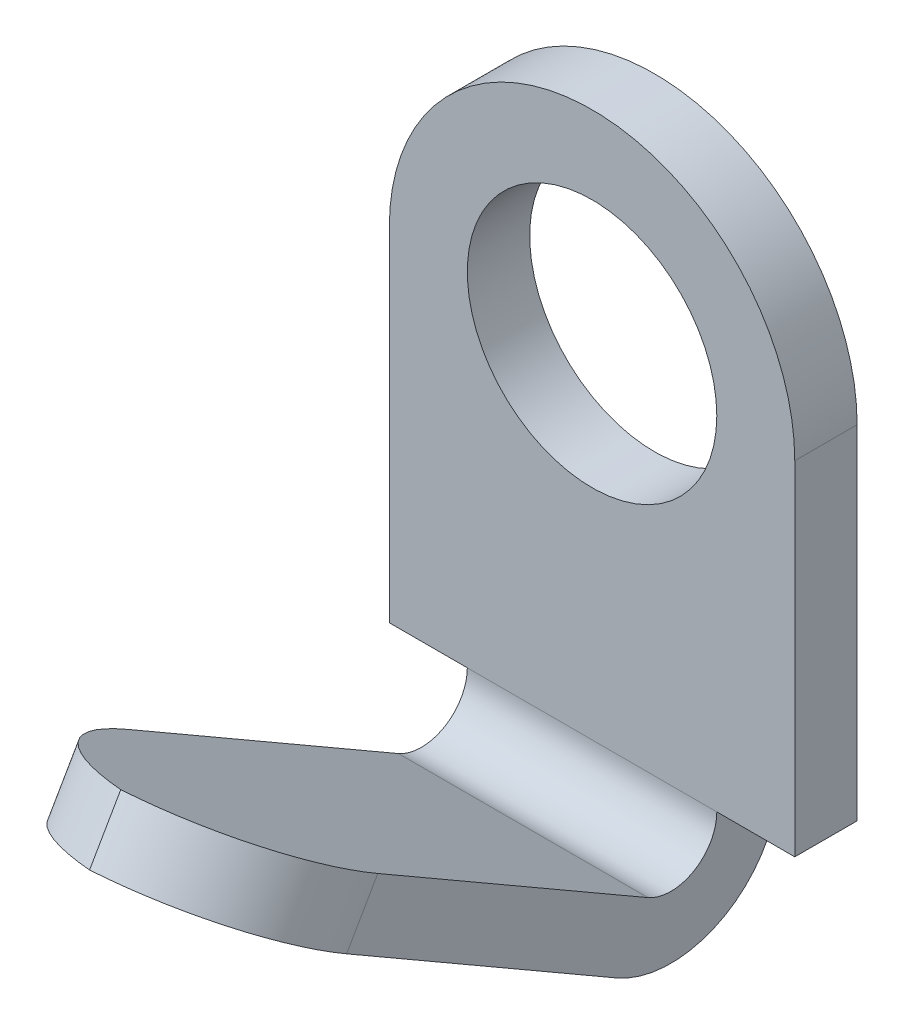
ISO-10303-21;
HEADER;
FILE_DESCRIPTION(('STEP AP214'),'2;1');
FILE_NAME('part.step','',(''),(''),'','','');
FILE_SCHEMA(('AUTOMOTIVE_DESIGN { 1 0 10303 214 1 1 1 1 }'));
ENDSEC;
DATA;
#1=APPLICATION_CONTEXT('core data for automotive mechanical design processes');
#2=APPLICATION_PROTOCOL_DEFINITION('international standard','automotive_design',2000,#1);
#3=PRODUCT_CONTEXT('',#1,'mechanical');
#4=PRODUCT('Part','Part','',(#3));
#5=PRODUCT_RELATED_PRODUCT_CATEGORY('part','',(#4));
#6=PRODUCT_DEFINITION_FORMATION('','',#4);
#7=PRODUCT_DEFINITION_CONTEXT('part definition',#1,'design');
#8=PRODUCT_DEFINITION('design','',#6,#7);
#9=PRODUCT_DEFINITION_SHAPE('','',#8);
#10=(LENGTH_UNIT() NAMED_UNIT(*) SI_UNIT(.MILLI.,.METRE.));
#11=(NAMED_UNIT(*) PLANE_ANGLE_UNIT() SI_UNIT($,.RADIAN.));
#12=(NAMED_UNIT(*) SI_UNIT($,.STERADIAN.) SOLID_ANGLE_UNIT());
#13=UNCERTAINTY_MEASURE_WITH_UNIT(LENGTH_MEASURE(1.E-05),#10,'distance_accuracy_value','');
#14=(GEOMETRIC_REPRESENTATION_CONTEXT(3) GLOBAL_UNCERTAINTY_ASSIGNED_CONTEXT((#13)) GLOBAL_UNIT_ASSIGNED_CONTEXT((#10,
#11,#12)) REPRESENTATION_CONTEXT('',''));
#15=CARTESIAN_POINT('',(0.,0.,0.));
#16=DIRECTION('',(0.,0.,1.));
#17=DIRECTION('',(1.,0.,0.));
#18=AXIS2_PLACEMENT_3D('',#15,#16,#17);
#19=CARTESIAN_POINT('',(-0.65,-1.1,0.2));
#20=DIRECTION('',(0.,1.,0.));
#21=DIRECTION('',(0.,0.,1.));
#22=AXIS2_PLACEMENT_3D('',#19,#20,#21);
#23=PLANE('',#22);
#24=DIRECTION('',(0.,0.,-1.));
#25=VECTOR('',#24,1.);
#26=CARTESIAN_POINT('',(-0.4,-1.1,0.));
#27=LINE('',#26,#25);
#28=CARTESIAN_POINT('',(-0.4,-1.1,0.2));
#29=VERTEX_POINT('',#28);
#30=CARTESIAN_POINT('',(-0.4,-1.1,0.));
#31=VERTEX_POINT('',#30);
#32=EDGE_CURVE('E132',#29,#31,#27,.T.);
#33=ORIENTED_EDGE('',*,*,#32,.F.);
#34=DIRECTION('',(1.,0.,0.));
#35=VECTOR('',#34,1.);
#36=CARTESIAN_POINT('',(-0.65,-1.1,0.2));
#37=LINE('',#36,#35);
#38=CARTESIAN_POINT('',(-0.65,-1.1,0.2));
#39=VERTEX_POINT('',#38);
#40=EDGE_CURVE('E140',#39,#29,#37,.T.);
#41=ORIENTED_EDGE('',*,*,#40,.F.);
#42=DIRECTION('',(0.,0.,-1.));
#43=VECTOR('',#42,1.);
#44=CARTESIAN_POINT('',(-0.65,-1.1,0.2));
#45=LINE('',#44,#43);
#46=CARTESIAN_POINT('',(-0.65,-1.1,0.));
#47=VERTEX_POINT('',#46);
#48=EDGE_CURVE('E174',#39,#47,#45,.T.);
#49=ORIENTED_EDGE('',*,*,#48,.T.);
#50=DIRECTION('',(1.,0.,0.));
#51=VECTOR('',#50,1.);
#52=CARTESIAN_POINT('',(-0.65,-1.1,0.));
#53=LINE('',#52,#51);
#54=EDGE_CURVE('E142',#47,#31,#53,.T.);
#55=ORIENTED_EDGE('',*,*,#54,.T.);
#56=EDGE_LOOP('',(#33,#41,#49,#55));
#57=FACE_BOUND('',#56,.T.);
#58=ADVANCED_FACE('F32',(#57),#23,.F.);
#59=CARTESIAN_POINT('',(0.,0.,0.2));
#60=DIRECTION('',(0.,0.,-1.));
#61=DIRECTION('',(-1.,0.,0.));
#62=AXIS2_PLACEMENT_3D('',#59,#60,#61);
#63=PLANE('',#62);
#64=CARTESIAN_POINT('',(0.,0.,0.2));
#65=DIRECTION('',(0.,0.,1.));
#66=DIRECTION('',(-1.,0.,0.));
#67=AXIS2_PLACEMENT_3D('',#64,#65,#66);
#68=CIRCLE('',#67,0.65);
#69=CARTESIAN_POINT('',(0.65,0.,0.2));
#70=VERTEX_POINT('',#69);
#71=CARTESIAN_POINT('',(-0.65,0.,0.2));
#72=VERTEX_POINT('',#71);
#73=EDGE_CURVE('E168',#70,#72,#68,.T.);
#74=ORIENTED_EDGE('',*,*,#73,.T.);
#75=DIRECTION('',(0.,-1.,0.));
#76=VECTOR('',#75,1.);
#77=CARTESIAN_POINT('',(-0.65,0.,0.2));
#78=LINE('',#77,#76);
#79=EDGE_CURVE('E148',#72,#39,#78,.T.);
#80=ORIENTED_EDGE('',*,*,#79,.T.);
#81=ORIENTED_EDGE('',*,*,#40,.T.);
#82=DIRECTION('',(1.,0.,0.));
#83=VECTOR('',#82,1.);
#84=CARTESIAN_POINT('',(-0.4,-1.1,0.2));
#85=LINE('',#84,#83);
#86=CARTESIAN_POINT('',(0.4,-1.1,0.2));
#87=VERTEX_POINT('',#86);
#88=EDGE_CURVE('E117',#29,#87,#85,.T.);
#89=ORIENTED_EDGE('',*,*,#88,.T.);
#90=CARTESIAN_POINT('',(0.65,-1.1,0.2));
#91=VERTEX_POINT('',#90);
#92=EDGE_CURVE('E151',#87,#91,#37,.T.);
#93=ORIENTED_EDGE('',*,*,#92,.T.);
#94=DIRECTION('',(0.,1.,0.));
#95=VECTOR('',#94,1.);
#96=CARTESIAN_POINT('',(0.65,-1.1,0.2));
#97=LINE('',#96,#95);
#98=EDGE_CURVE('E150',#91,#70,#97,.T.);
#99=ORIENTED_EDGE('',*,*,#98,.T.);
#100=EDGE_LOOP('',(#74,#80,#81,#89,#93,#99));
#101=FACE_BOUND('',#100,.T.);
#102=CARTESIAN_POINT('',(0.,0.,0.2));
#103=DIRECTION('',(0.,0.,1.));
#104=DIRECTION('',(1.,0.,0.));
#105=AXIS2_PLACEMENT_3D('',#102,#103,#104);
#106=CIRCLE('',#105,0.4);
#107=CARTESIAN_POINT('',(0.4,0.,0.2));
#108=VERTEX_POINT('',#107);
#109=EDGE_CURVE('E162',#108,#108,#106,.T.);
#110=ORIENTED_EDGE('',*,*,#109,.F.);
#111=EDGE_LOOP('',(#110));
#112=FACE_BOUND('',#111,.T.);
#113=ADVANCED_FACE('F146',(#101,#112),#63,.F.);
#114=CARTESIAN_POINT('',(0.,0.,0.));
#115=DIRECTION('',(0.,0.,-1.));
#116=DIRECTION('',(-1.,0.,0.));
#117=AXIS2_PLACEMENT_3D('',#114,#115,#116);
#118=PLANE('',#117);
#119=CARTESIAN_POINT('',(0.,0.,0.));
#120=DIRECTION('',(0.,0.,1.));
#121=DIRECTION('',(-1.,0.,0.));
#122=AXIS2_PLACEMENT_3D('',#119,#120,#121);
#123=CIRCLE('',#122,0.65);
#124=CARTESIAN_POINT('',(0.65,0.,0.));
#125=VERTEX_POINT('',#124);
#126=CARTESIAN_POINT('',(-0.65,0.,0.));
#127=VERTEX_POINT('',#126);
#128=EDGE_CURVE('E158',#125,#127,#123,.T.);
#129=ORIENTED_EDGE('',*,*,#128,.F.);
#130=DIRECTION('',(0.,1.,0.));
#131=VECTOR('',#130,1.);
#132=CARTESIAN_POINT('',(0.65,-1.1,0.));
#133=LINE('',#132,#131);
#134=CARTESIAN_POINT('',(0.65,-1.1,0.));
#135=VERTEX_POINT('',#134);
#136=EDGE_CURVE('E166',#135,#125,#133,.T.);
#137=ORIENTED_EDGE('',*,*,#136,.F.);
#138=CARTESIAN_POINT('',(0.4,-1.1,0.));
#139=VERTEX_POINT('',#138);
#140=EDGE_CURVE('E164',#139,#135,#53,.T.);
#141=ORIENTED_EDGE('',*,*,#140,.F.);
#142=DIRECTION('',(1.,0.,0.));
#143=VECTOR('',#142,1.);
#144=CARTESIAN_POINT('',(-0.4,-1.1,0.));
#145=LINE('',#144,#143);
#146=EDGE_CURVE('E219',#31,#139,#145,.T.);
#147=ORIENTED_EDGE('',*,*,#146,.F.);
#148=ORIENTED_EDGE('',*,*,#54,.F.);
#149=DIRECTION('',(0.,-1.,0.));
#150=VECTOR('',#149,1.);
#151=CARTESIAN_POINT('',(-0.65,0.,0.));
#152=LINE('',#151,#150);
#153=EDGE_CURVE('E161',#127,#47,#152,.T.);
#154=ORIENTED_EDGE('',*,*,#153,.F.);
#155=EDGE_LOOP('',(#129,#137,#141,#147,#148,#154));
#156=FACE_BOUND('',#155,.T.);
#157=CARTESIAN_POINT('',(0.,0.,0.));
#158=DIRECTION('',(0.,0.,1.));
#159=DIRECTION('',(1.,0.,0.));
#160=AXIS2_PLACEMENT_3D('',#157,#158,#159);
#161=CIRCLE('',#160,0.4);
#162=CARTESIAN_POINT('',(0.4,0.,0.));
#163=VERTEX_POINT('',#162);
#164=EDGE_CURVE('E221',#163,#163,#161,.T.);
#165=ORIENTED_EDGE('',*,*,#164,.T.);
#166=EDGE_LOOP('',(#165));
#167=FACE_BOUND('',#166,.T.);
#168=ADVANCED_FACE('F238',(#156,#167),#118,.T.);
#169=CARTESIAN_POINT('',(0.,0.,0.2));
#170=DIRECTION('',(0.,0.,-1.));
#171=DIRECTION('',(-1.,0.,0.));
#172=AXIS2_PLACEMENT_3D('',#169,#170,#171);
#173=CYLINDRICAL_SURFACE('',#172,0.65);
#174=ORIENTED_EDGE('',*,*,#128,.T.);
#175=DIRECTION('',(0.,0.,-1.));
#176=VECTOR('',#175,1.);
#177=CARTESIAN_POINT('',(-0.65,0.,0.2));
#178=LINE('',#177,#176);
#179=EDGE_CURVE('E176',#72,#127,#178,.T.);
#180=ORIENTED_EDGE('',*,*,#179,.F.);
#181=ORIENTED_EDGE('',*,*,#73,.F.);
#182=DIRECTION('',(0.,0.,-1.));
#183=VECTOR('',#182,1.);
#184=CARTESIAN_POINT('',(0.65,0.,0.2));
#185=LINE('',#184,#183);
#186=EDGE_CURVE('E153',#70,#125,#185,.T.);
#187=ORIENTED_EDGE('',*,*,#186,.T.);
#188=EDGE_LOOP('',(#174,#180,#181,#187));
#189=FACE_BOUND('',#188,.T.);
#190=ADVANCED_FACE('F233',(#189),#173,.T.);
#191=CARTESIAN_POINT('',(-0.65,0.,0.2));
#192=DIRECTION('',(1.,0.,0.));
#193=DIRECTION('',(0.,1.,0.));
#194=AXIS2_PLACEMENT_3D('',#191,#192,#193);
#195=PLANE('',#194);
#196=ORIENTED_EDGE('',*,*,#153,.T.);
#197=ORIENTED_EDGE('',*,*,#48,.F.);
#198=ORIENTED_EDGE('',*,*,#79,.F.);
#199=ORIENTED_EDGE('',*,*,#179,.T.);
#200=EDGE_LOOP('',(#196,#197,#198,#199));
#201=FACE_BOUND('',#200,.T.);
#202=ADVANCED_FACE('F236',(#201),#195,.F.);
#203=ORIENTED_EDGE('',*,*,#92,.F.);
#204=DIRECTION('',(0.,0.,-1.));
#205=VECTOR('',#204,1.);
#206=CARTESIAN_POINT('',(0.4,-1.1,0.));
#207=LINE('',#206,#205);
#208=EDGE_CURVE('E208',#87,#139,#207,.T.);
#209=ORIENTED_EDGE('',*,*,#208,.T.);
#210=ORIENTED_EDGE('',*,*,#140,.T.);
#211=DIRECTION('',(0.,0.,-1.));
#212=VECTOR('',#211,1.);
#213=CARTESIAN_POINT('',(0.65,-1.1,0.2));
#214=LINE('',#213,#212);
#215=EDGE_CURVE('E171',#91,#135,#214,.T.);
#216=ORIENTED_EDGE('',*,*,#215,.F.);
#217=EDGE_LOOP('',(#203,#209,#210,#216));
#218=FACE_BOUND('',#217,.T.);
#219=ADVANCED_FACE('F261',(#218),#23,.F.);
#220=CARTESIAN_POINT('',(0.65,-1.1,0.2));
#221=DIRECTION('',(-1.,0.,0.));
#222=DIRECTION('',(0.,-1.,0.));
#223=AXIS2_PLACEMENT_3D('',#220,#221,#222);
#224=PLANE('',#223);
#225=ORIENTED_EDGE('',*,*,#136,.T.);
#226=ORIENTED_EDGE('',*,*,#186,.F.);
#227=ORIENTED_EDGE('',*,*,#98,.F.);
#228=ORIENTED_EDGE('',*,*,#215,.T.);
#229=EDGE_LOOP('',(#225,#226,#227,#228));
#230=FACE_BOUND('',#229,.T.);
#231=ADVANCED_FACE('F255',(#230),#224,.F.);
#232=CARTESIAN_POINT('',(0.,0.,0.2));
#233=DIRECTION('',(0.,0.,-1.));
#234=DIRECTION('',(-1.,0.,0.));
#235=AXIS2_PLACEMENT_3D('',#232,#233,#234);
#236=CYLINDRICAL_SURFACE('',#235,0.4);
#237=ORIENTED_EDGE('',*,*,#109,.T.);
#238=EDGE_LOOP('',(#237));
#239=FACE_BOUND('',#238,.T.);
#240=ORIENTED_EDGE('',*,*,#164,.F.);
#241=EDGE_LOOP('',(#240));
#242=FACE_BOUND('',#241,.T.);
#243=ADVANCED_FACE('F248',(#239,#242),#236,.F.);
#244=CARTESIAN_POINT('',(-0.4,-1.1,0.347307929548894));
#245=DIRECTION('',(1.,0.,0.));
#246=DIRECTION('',(0.,0.,-1.));
#247=AXIS2_PLACEMENT_3D('',#244,#245,#246);
#248=CYLINDRICAL_SURFACE('',#247,0.347307929548894);
#249=CARTESIAN_POINT('',(0.4,-1.1,0.347307929548894));
#250=DIRECTION('',(1.,0.,0.));
#251=DIRECTION('',(0.,0.,-1.));
#252=AXIS2_PLACEMENT_3D('',#249,#250,#251);
#253=CIRCLE('',#252,0.347307929548894);
#254=CARTESIAN_POINT('',(0.4,-1.40077748992512,0.52096189432334));
#255=VERTEX_POINT('',#254);
#256=EDGE_CURVE('E143',#139,#255,#253,.F.);
#257=ORIENTED_EDGE('',*,*,#256,.T.);
#258=DIRECTION('',(1.,0.,0.));
#259=VECTOR('',#258,1.);
#260=CARTESIAN_POINT('',(-0.4,-1.40077748992512,0.52096189432334));
#261=LINE('',#260,#259);
#262=CARTESIAN_POINT('',(-0.4,-1.40077748992512,0.52096189432334));
#263=VERTEX_POINT('',#262);
#264=EDGE_CURVE('E222',#263,#255,#261,.T.);
#265=ORIENTED_EDGE('',*,*,#264,.F.);
#266=CARTESIAN_POINT('',(-0.4,-1.1,0.347307929548894));
#267=DIRECTION('',(1.,0.,0.));
#268=DIRECTION('',(0.,0.,-1.));
#269=AXIS2_PLACEMENT_3D('',#266,#267,#268);
#270=CIRCLE('',#269,0.347307929548894);
#271=EDGE_CURVE('E127',#31,#263,#270,.F.);
#272=ORIENTED_EDGE('',*,*,#271,.F.);
#273=ORIENTED_EDGE('',*,*,#146,.T.);
#274=EDGE_LOOP('',(#257,#265,#272,#273));
#275=FACE_BOUND('',#274,.T.);
#276=ADVANCED_FACE('F243',(#275),#248,.T.);
#277=CARTESIAN_POINT('',(-0.4,-1.27616623488768,0.736794919243109));
#278=DIRECTION('',(0.,0.86602540378444,-0.499999999999998));
#279=DIRECTION('',(0.,0.499999999999998,0.86602540378444));
#280=AXIS2_PLACEMENT_3D('',#277,#278,#279);
#281=PLANE('',#280);
#282=DIRECTION('',(0.,0.499999999999998,0.86602540378444));
#283=VECTOR('',#282,1.);
#284=CARTESIAN_POINT('',(0.4,-1.27616623488768,0.736794919243109));
#285=LINE('',#284,#283);
#286=CARTESIAN_POINT('',(0.4,-0.900777489925121,1.38698729810778));
#287=VERTEX_POINT('',#286);
#288=EDGE_CURVE('E199',#255,#287,#285,.T.);
#289=ORIENTED_EDGE('',*,*,#288,.T.);
#290=CARTESIAN_POINT('',(-0.1,-0.900777489925121,1.38698729810778));
#291=DIRECTION('',(0.,0.86602540378444,-0.499999999999998));
#292=DIRECTION('',(0.,0.499999999999998,0.86602540378444));
#293=AXIS2_PLACEMENT_3D('',#290,#291,#292);
#294=CIRCLE('',#293,0.5);
#295=CARTESIAN_POINT('',(0.,-0.655828515646804,1.81125136681971));
#296=VERTEX_POINT('',#295);
#297=EDGE_CURVE('E184',#287,#296,#294,.F.);
#298=ORIENTED_EDGE('',*,*,#297,.T.);
#299=CARTESIAN_POINT('',(0.1,-0.900777489925121,1.38698729810778));
#300=DIRECTION('',(0.,0.86602540378444,-0.499999999999998));
#301=DIRECTION('',(0.,0.499999999999998,0.86602540378444));
#302=AXIS2_PLACEMENT_3D('',#299,#300,#301);
#303=CIRCLE('',#302,0.5);
#304=CARTESIAN_POINT('',(-0.4,-0.900777489925121,1.38698729810778));
#305=VERTEX_POINT('',#304);
#306=EDGE_CURVE('E182',#296,#305,#303,.F.);
#307=ORIENTED_EDGE('',*,*,#306,.T.);
#308=DIRECTION('',(0.,0.499999999999998,0.86602540378444));
#309=VECTOR('',#308,1.);
#310=CARTESIAN_POINT('',(-0.4,-1.27616623488768,0.736794919243109));
#311=LINE('',#310,#309);
#312=EDGE_CURVE('E245',#263,#305,#311,.T.);
#313=ORIENTED_EDGE('',*,*,#312,.F.);
#314=ORIENTED_EDGE('',*,*,#264,.T.);
#315=EDGE_LOOP('',(#289,#298,#307,#313,#314));
#316=FACE_BOUND('',#315,.T.);
#317=ADVANCED_FACE('F204',(#316),#281,.F.);
#318=CARTESIAN_POINT('',(-0.4,-1.10296115413079,0.636794919243109));
#319=DIRECTION('',(0.,0.86602540378444,-0.499999999999998));
#320=DIRECTION('',(0.,0.499999999999998,0.86602540378444));
#321=AXIS2_PLACEMENT_3D('',#318,#319,#320);
#322=PLANE('',#321);
#323=CARTESIAN_POINT('',(0.1,-0.727572409168233,1.28698729810778));
#324=DIRECTION('',(0.,0.86602540378444,-0.499999999999998));
#325=DIRECTION('',(0.,0.499999999999998,0.86602540378444));
#326=AXIS2_PLACEMENT_3D('',#323,#324,#325);
#327=CIRCLE('',#326,0.5);
#328=CARTESIAN_POINT('',(-0.4,-0.727572409168233,1.28698729810778));
#329=VERTEX_POINT('',#328);
#330=CARTESIAN_POINT('',(0.,-0.482623434889916,1.71125136681971));
#331=VERTEX_POINT('',#330);
#332=EDGE_CURVE('E48',#329,#331,#327,.T.);
#333=ORIENTED_EDGE('',*,*,#332,.T.);
#334=CARTESIAN_POINT('',(-0.1,-0.727572409168233,1.28698729810778));
#335=DIRECTION('',(0.,0.86602540378444,-0.499999999999998));
#336=DIRECTION('',(0.,0.499999999999998,0.86602540378444));
#337=AXIS2_PLACEMENT_3D('',#334,#335,#336);
#338=CIRCLE('',#337,0.5);
#339=CARTESIAN_POINT('',(0.4,-0.727572409168233,1.28698729810778));
#340=VERTEX_POINT('',#339);
#341=EDGE_CURVE('E41',#331,#340,#338,.T.);
#342=ORIENTED_EDGE('',*,*,#341,.T.);
#343=DIRECTION('',(0.,0.499999999999998,0.86602540378444));
#344=VECTOR('',#343,1.);
#345=CARTESIAN_POINT('',(0.4,-1.10296115413079,0.636794919243109));
#346=LINE('',#345,#344);
#347=CARTESIAN_POINT('',(0.4,-1.22757240916823,0.420961894323341));
#348=VERTEX_POINT('',#347);
#349=EDGE_CURVE('E191',#348,#340,#346,.T.);
#350=ORIENTED_EDGE('',*,*,#349,.F.);
#351=DIRECTION('',(1.,0.,0.));
#352=VECTOR('',#351,1.);
#353=CARTESIAN_POINT('',(-0.4,-1.22757240916823,0.420961894323341));
#354=LINE('',#353,#352);
#355=CARTESIAN_POINT('',(-0.4,-1.22757240916823,0.420961894323341));
#356=VERTEX_POINT('',#355);
#357=EDGE_CURVE('E126',#356,#348,#354,.T.);
#358=ORIENTED_EDGE('',*,*,#357,.F.);
#359=DIRECTION('',(0.,0.499999999999998,0.86602540378444));
#360=VECTOR('',#359,1.);
#361=CARTESIAN_POINT('',(-0.4,-1.10296115413079,0.636794919243109));
#362=LINE('',#361,#360);
#363=EDGE_CURVE('E134',#356,#329,#362,.T.);
#364=ORIENTED_EDGE('',*,*,#363,.T.);
#365=EDGE_LOOP('',(#333,#342,#350,#358,#364));
#366=FACE_BOUND('',#365,.T.);
#367=ADVANCED_FACE('F190',(#366),#322,.T.);
#368=CARTESIAN_POINT('',(-0.4,-1.1,0.347307929548894));
#369=DIRECTION('',(1.,0.,0.));
#370=DIRECTION('',(0.,0.,-1.));
#371=AXIS2_PLACEMENT_3D('',#368,#369,#370);
#372=CYLINDRICAL_SURFACE('',#371,0.147307929548894);
#373=CARTESIAN_POINT('',(0.4,-1.1,0.347307929548894));
#374=DIRECTION('',(1.,0.,0.));
#375=DIRECTION('',(0.,0.,-1.));
#376=AXIS2_PLACEMENT_3D('',#373,#374,#375);
#377=CIRCLE('',#376,0.147307929548894);
#378=EDGE_CURVE('E122',#87,#348,#377,.F.);
#379=ORIENTED_EDGE('',*,*,#378,.F.);
#380=ORIENTED_EDGE('',*,*,#88,.F.);
#381=CARTESIAN_POINT('',(-0.4,-1.1,0.347307929548894));
#382=DIRECTION('',(1.,0.,0.));
#383=DIRECTION('',(0.,0.,-1.));
#384=AXIS2_PLACEMENT_3D('',#381,#382,#383);
#385=CIRCLE('',#384,0.147307929548894);
#386=EDGE_CURVE('E120',#29,#356,#385,.F.);
#387=ORIENTED_EDGE('',*,*,#386,.T.);
#388=ORIENTED_EDGE('',*,*,#357,.T.);
#389=EDGE_LOOP('',(#379,#380,#387,#388));
#390=FACE_BOUND('',#389,.T.);
#391=ADVANCED_FACE('F119',(#390),#372,.F.);
#392=CARTESIAN_POINT('',(-0.4,0.,0.));
#393=DIRECTION('',(1.,0.,0.));
#394=DIRECTION('',(0.,0.,-1.));
#395=AXIS2_PLACEMENT_3D('',#392,#393,#394);
#396=PLANE('',#395);
#397=ORIENTED_EDGE('',*,*,#312,.T.);
#398=DIRECTION('',(0.,-0.86602540378444,0.499999999999997));
#399=VECTOR('',#398,1.);
#400=CARTESIAN_POINT('',(-0.4,-0.727572409168233,1.28698729810778));
#401=LINE('',#400,#399);
#402=EDGE_CURVE('E11',#305,#329,#401,.F.);
#403=ORIENTED_EDGE('',*,*,#402,.T.);
#404=ORIENTED_EDGE('',*,*,#363,.F.);
#405=ORIENTED_EDGE('',*,*,#386,.F.);
#406=ORIENTED_EDGE('',*,*,#32,.T.);
#407=ORIENTED_EDGE('',*,*,#271,.T.);
#408=EDGE_LOOP('',(#397,#403,#404,#405,#406,#407));
#409=FACE_BOUND('',#408,.T.);
#410=ADVANCED_FACE('F131',(#409),#396,.F.);
#411=CARTESIAN_POINT('',(0.4,0.,0.));
#412=DIRECTION('',(1.,0.,0.));
#413=DIRECTION('',(0.,0.,-1.));
#414=AXIS2_PLACEMENT_3D('',#411,#412,#413);
#415=PLANE('',#414);
#416=ORIENTED_EDGE('',*,*,#349,.T.);
#417=DIRECTION('',(0.,-0.86602540378444,0.499999999999997));
#418=VECTOR('',#417,1.);
#419=CARTESIAN_POINT('',(0.4,0.375388744962559,0.650192378864672));
#420=LINE('',#419,#418);
#421=EDGE_CURVE('E179',#340,#287,#420,.T.);
#422=ORIENTED_EDGE('',*,*,#421,.T.);
#423=ORIENTED_EDGE('',*,*,#288,.F.);
#424=ORIENTED_EDGE('',*,*,#256,.F.);
#425=ORIENTED_EDGE('',*,*,#208,.F.);
#426=ORIENTED_EDGE('',*,*,#378,.T.);
#427=EDGE_LOOP('',(#416,#422,#423,#424,#425,#426));
#428=FACE_BOUND('',#427,.T.);
#429=ADVANCED_FACE('F196',(#428),#415,.T.);
#430=CARTESIAN_POINT('',(0.1,0.375388744962559,0.650192378864672));
#431=DIRECTION('',(0.,0.86602540378444,-0.499999999999997));
#432=DIRECTION('',(0.,0.499999999999997,0.86602540378444));
#433=AXIS2_PLACEMENT_3D('',#430,#431,#432);
#434=CYLINDRICAL_SURFACE('',#433,0.5);
#435=DIRECTION('',(0.,0.86602540378444,-0.499999999999997));
#436=VECTOR('',#435,1.);
#437=CARTESIAN_POINT('',(0.,-0.56922597526836,1.76125136681971));
#438=LINE('',#437,#436);
#439=EDGE_CURVE('E36',#331,#296,#438,.F.);
#440=ORIENTED_EDGE('',*,*,#439,.F.);
#441=ORIENTED_EDGE('',*,*,#332,.F.);
#442=ORIENTED_EDGE('',*,*,#402,.F.);
#443=ORIENTED_EDGE('',*,*,#306,.F.);
#444=EDGE_LOOP('',(#440,#441,#442,#443));
#445=FACE_BOUND('',#444,.T.);
#446=ADVANCED_FACE('F34',(#445),#434,.T.);
#447=CARTESIAN_POINT('',(-0.1,0.375388744962559,0.650192378864672));
#448=DIRECTION('',(0.,-0.86602540378444,0.499999999999997));
#449=DIRECTION('',(0.,-0.499999999999997,-0.86602540378444));
#450=AXIS2_PLACEMENT_3D('',#447,#448,#449);
#451=CYLINDRICAL_SURFACE('',#450,0.5);
#452=ORIENTED_EDGE('',*,*,#341,.F.);
#453=ORIENTED_EDGE('',*,*,#439,.T.);
#454=ORIENTED_EDGE('',*,*,#297,.F.);
#455=ORIENTED_EDGE('',*,*,#421,.F.);
#456=EDGE_LOOP('',(#452,#453,#454,#455));
#457=FACE_BOUND('',#456,.T.);
#458=ADVANCED_FACE('F201',(#457),#451,.T.);
#459=CLOSED_SHELL('',(#58,#113,#168,#190,#202,#219,#231,#243,#276,#317,#367,#391,#410,#429,#446,#458));
#460=MANIFOLD_SOLID_BREP('B2',#459);
#461=ADVANCED_BREP_SHAPE_REPRESENTATION('',(#18,#460),#14);
#462=SHAPE_DEFINITION_REPRESENTATION(#9,#461);
ENDSEC;
END-ISO-10303-21;
